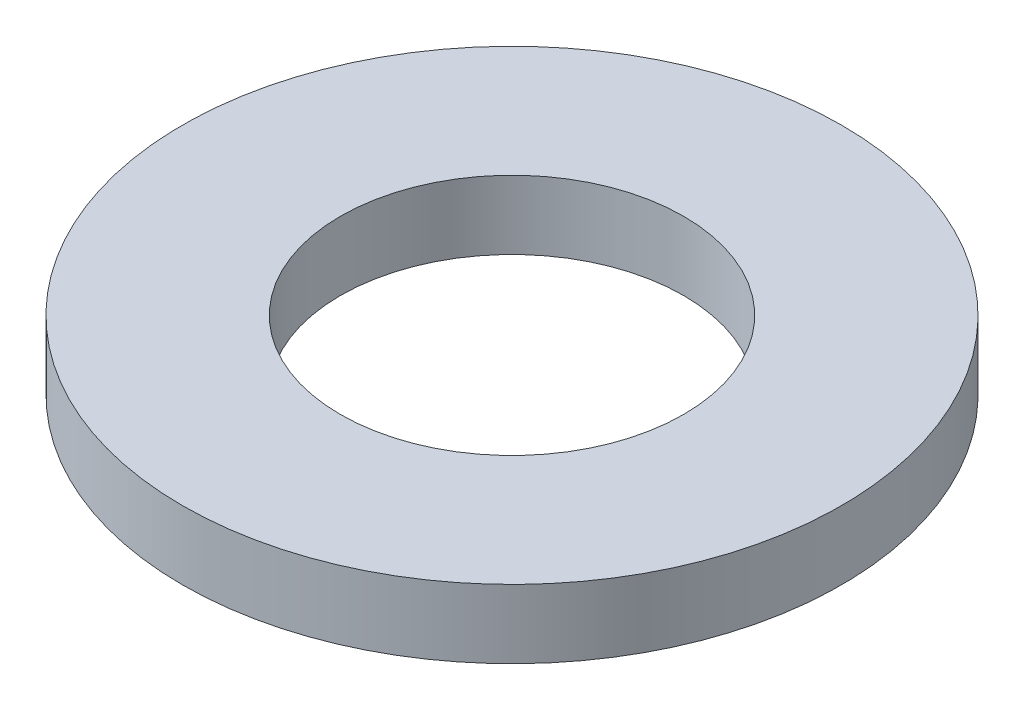
ISO-10303-21;
HEADER;
FILE_DESCRIPTION(('STEP AP214'),'2;1');
FILE_NAME('part.step','',(''),(''),'','','');
FILE_SCHEMA(('AUTOMOTIVE_DESIGN { 1 0 10303 214 1 1 1 1 }'));
ENDSEC;
DATA;
#1=APPLICATION_CONTEXT('core data for automotive mechanical design processes');
#2=APPLICATION_PROTOCOL_DEFINITION('international standard','automotive_design',2000,#1);
#3=PRODUCT_CONTEXT('',#1,'mechanical');
#4=PRODUCT('Part','Part','',(#3));
#5=PRODUCT_RELATED_PRODUCT_CATEGORY('part','',(#4));
#6=PRODUCT_DEFINITION_FORMATION('','',#4);
#7=PRODUCT_DEFINITION_CONTEXT('part definition',#1,'design');
#8=PRODUCT_DEFINITION('design','',#6,#7);
#9=PRODUCT_DEFINITION_SHAPE('','',#8);
#10=(LENGTH_UNIT() NAMED_UNIT(*) SI_UNIT(.MILLI.,.METRE.));
#11=(NAMED_UNIT(*) PLANE_ANGLE_UNIT() SI_UNIT($,.RADIAN.));
#12=(NAMED_UNIT(*) SI_UNIT($,.STERADIAN.) SOLID_ANGLE_UNIT());
#13=UNCERTAINTY_MEASURE_WITH_UNIT(LENGTH_MEASURE(1.E-05),#10,'distance_accuracy_value','');
#14=(GEOMETRIC_REPRESENTATION_CONTEXT(3) GLOBAL_UNCERTAINTY_ASSIGNED_CONTEXT((#13)) GLOBAL_UNIT_ASSIGNED_CONTEXT((#10,
#11,#12)) REPRESENTATION_CONTEXT('',''));
#15=CARTESIAN_POINT('',(0.,0.,0.));
#16=DIRECTION('',(0.,0.,1.));
#17=DIRECTION('',(1.,0.,0.));
#18=AXIS2_PLACEMENT_3D('',#15,#16,#17);
#19=CARTESIAN_POINT('',(0.,2.5,0.));
#20=DIRECTION('',(0.,1.,0.));
#21=DIRECTION('',(0.,0.,1.));
#22=AXIS2_PLACEMENT_3D('',#19,#20,#21);
#23=PLANE('',#22);
#24=CARTESIAN_POINT('',(0.,2.5,0.));
#25=DIRECTION('',(0.,1.,0.));
#26=DIRECTION('',(0.,0.,1.));
#27=AXIS2_PLACEMENT_3D('',#24,#25,#26);
#28=CIRCLE('',#27,12.);
#29=CARTESIAN_POINT('',(0.,2.5,12.));
#30=VERTEX_POINT('',#29);
#31=EDGE_CURVE('E10',#30,#30,#28,.T.);
#32=ORIENTED_EDGE('',*,*,#31,.T.);
#33=EDGE_LOOP('',(#32));
#34=FACE_BOUND('',#33,.T.);
#35=CARTESIAN_POINT('',(0.,2.5,0.));
#36=DIRECTION('',(0.,1.,0.));
#37=DIRECTION('',(0.,0.,1.));
#38=AXIS2_PLACEMENT_3D('',#35,#36,#37);
#39=CIRCLE('',#38,6.25);
#40=CARTESIAN_POINT('',(0.,2.5,6.25));
#41=VERTEX_POINT('',#40);
#42=EDGE_CURVE('E25',#41,#41,#39,.T.);
#43=ORIENTED_EDGE('',*,*,#42,.F.);
#44=EDGE_LOOP('',(#43));
#45=FACE_BOUND('',#44,.T.);
#46=ADVANCED_FACE('F14',(#34,#45),#23,.T.);
#47=CARTESIAN_POINT('',(0.,0.,0.));
#48=DIRECTION('',(0.,1.,0.));
#49=DIRECTION('',(0.,0.,1.));
#50=AXIS2_PLACEMENT_3D('',#47,#48,#49);
#51=PLANE('',#50);
#52=CARTESIAN_POINT('',(0.,0.,0.));
#53=DIRECTION('',(0.,1.,0.));
#54=DIRECTION('',(0.,0.,1.));
#55=AXIS2_PLACEMENT_3D('',#52,#53,#54);
#56=CIRCLE('',#55,12.);
#57=CARTESIAN_POINT('',(0.,0.,12.));
#58=VERTEX_POINT('',#57);
#59=EDGE_CURVE('E21',#58,#58,#56,.T.);
#60=ORIENTED_EDGE('',*,*,#59,.F.);
#61=EDGE_LOOP('',(#60));
#62=FACE_BOUND('',#61,.T.);
#63=CARTESIAN_POINT('',(0.,0.,0.));
#64=DIRECTION('',(0.,1.,0.));
#65=DIRECTION('',(0.,0.,1.));
#66=AXIS2_PLACEMENT_3D('',#63,#64,#65);
#67=CIRCLE('',#66,6.25);
#68=CARTESIAN_POINT('',(0.,0.,6.25));
#69=VERTEX_POINT('',#68);
#70=EDGE_CURVE('E29',#69,#69,#67,.T.);
#71=ORIENTED_EDGE('',*,*,#70,.T.);
#72=EDGE_LOOP('',(#71));
#73=FACE_BOUND('',#72,.T.);
#74=ADVANCED_FACE('F35',(#62,#73),#51,.F.);
#75=CARTESIAN_POINT('',(0.,2.5,0.));
#76=DIRECTION('',(0.,-1.,0.));
#77=DIRECTION('',(0.,0.,-1.));
#78=AXIS2_PLACEMENT_3D('',#75,#76,#77);
#79=CYLINDRICAL_SURFACE('',#78,12.);
#80=ORIENTED_EDGE('',*,*,#31,.F.);
#81=EDGE_LOOP('',(#80));
#82=FACE_BOUND('',#81,.T.);
#83=ORIENTED_EDGE('',*,*,#59,.T.);
#84=EDGE_LOOP('',(#83));
#85=FACE_BOUND('',#84,.T.);
#86=ADVANCED_FACE('F16',(#82,#85),#79,.T.);
#87=CARTESIAN_POINT('',(0.,2.5,0.));
#88=DIRECTION('',(0.,-1.,0.));
#89=DIRECTION('',(0.,0.,-1.));
#90=AXIS2_PLACEMENT_3D('',#87,#88,#89);
#91=CYLINDRICAL_SURFACE('',#90,6.25);
#92=ORIENTED_EDGE('',*,*,#42,.T.);
#93=EDGE_LOOP('',(#92));
#94=FACE_BOUND('',#93,.T.);
#95=ORIENTED_EDGE('',*,*,#70,.F.);
#96=EDGE_LOOP('',(#95));
#97=FACE_BOUND('',#96,.T.);
#98=ADVANCED_FACE('F37',(#94,#97),#91,.F.);
#99=CLOSED_SHELL('',(#46,#74,#86,#98));
#100=MANIFOLD_SOLID_BREP('B1',#99);
#101=ADVANCED_BREP_SHAPE_REPRESENTATION('',(#18,#100),#14);
#102=SHAPE_DEFINITION_REPRESENTATION(#9,#101);
ENDSEC;
END-ISO-10303-21;
